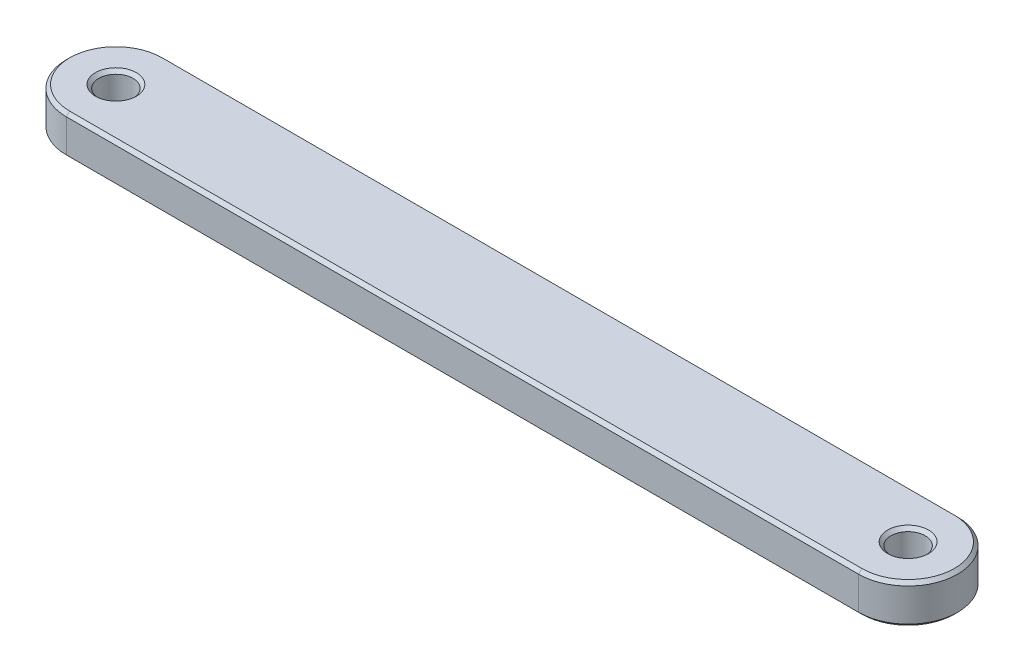
ISO-10303-21;
HEADER;
FILE_DESCRIPTION(('STEP AP214'),'2;1');
FILE_NAME('part.step','',(''),(''),'','','');
FILE_SCHEMA(('AUTOMOTIVE_DESIGN { 1 0 10303 214 1 1 1 1 }'));
ENDSEC;
DATA;
#1=APPLICATION_CONTEXT('core data for automotive mechanical design processes');
#2=APPLICATION_PROTOCOL_DEFINITION('international standard','automotive_design',2000,#1);
#3=PRODUCT_CONTEXT('',#1,'mechanical');
#4=PRODUCT('Part','Part','',(#3));
#5=PRODUCT_RELATED_PRODUCT_CATEGORY('part','',(#4));
#6=PRODUCT_DEFINITION_FORMATION('','',#4);
#7=PRODUCT_DEFINITION_CONTEXT('part definition',#1,'design');
#8=PRODUCT_DEFINITION('design','',#6,#7);
#9=PRODUCT_DEFINITION_SHAPE('','',#8);
#10=(LENGTH_UNIT() NAMED_UNIT(*) SI_UNIT(.MILLI.,.METRE.));
#11=(NAMED_UNIT(*) PLANE_ANGLE_UNIT() SI_UNIT($,.RADIAN.));
#12=(NAMED_UNIT(*) SI_UNIT($,.STERADIAN.) SOLID_ANGLE_UNIT());
#13=UNCERTAINTY_MEASURE_WITH_UNIT(LENGTH_MEASURE(1.E-05),#10,'distance_accuracy_value','');
#14=(GEOMETRIC_REPRESENTATION_CONTEXT(3) GLOBAL_UNCERTAINTY_ASSIGNED_CONTEXT((#13)) GLOBAL_UNIT_ASSIGNED_CONTEXT((#10,
#11,#12)) REPRESENTATION_CONTEXT('',''));
#15=CARTESIAN_POINT('',(0.,0.,0.));
#16=DIRECTION('',(0.,0.,1.));
#17=DIRECTION('',(1.,0.,0.));
#18=AXIS2_PLACEMENT_3D('',#15,#16,#17);
#19=CARTESIAN_POINT('',(0.,3.,7.5));
#20=DIRECTION('',(0.,0.,-1.));
#21=DIRECTION('',(-1.,0.,0.));
#22=AXIS2_PLACEMENT_3D('',#19,#20,#21);
#23=PLANE('',#22);
#24=DIRECTION('',(0.,-1.,0.));
#25=VECTOR('',#24,1.);
#26=CARTESIAN_POINT('',(0.,3.,7.5));
#27=LINE('',#26,#25);
#28=CARTESIAN_POINT('',(0.,2.5,7.5));
#29=VERTEX_POINT('',#28);
#30=CARTESIAN_POINT('',(0.,-2.5,7.5));
#31=VERTEX_POINT('',#30);
#32=EDGE_CURVE('E163',#29,#31,#27,.T.);
#33=ORIENTED_EDGE('',*,*,#32,.T.);
#34=DIRECTION('',(1.,0.,0.));
#35=VECTOR('',#34,1.);
#36=CARTESIAN_POINT('',(0.,-2.5,7.5));
#37=LINE('',#36,#35);
#38=CARTESIAN_POINT('',(120.,-2.5,7.5));
#39=VERTEX_POINT('',#38);
#40=EDGE_CURVE('E201',#31,#39,#37,.T.);
#41=ORIENTED_EDGE('',*,*,#40,.T.);
#42=DIRECTION('',(0.,-1.,0.));
#43=VECTOR('',#42,1.);
#44=CARTESIAN_POINT('',(120.,3.,7.5));
#45=LINE('',#44,#43);
#46=CARTESIAN_POINT('',(120.,2.5,7.5));
#47=VERTEX_POINT('',#46);
#48=EDGE_CURVE('E133',#47,#39,#45,.T.);
#49=ORIENTED_EDGE('',*,*,#48,.F.);
#50=DIRECTION('',(-1.,0.,0.));
#51=VECTOR('',#50,1.);
#52=CARTESIAN_POINT('',(0.,2.5,7.5));
#53=LINE('',#52,#51);
#54=EDGE_CURVE('E204',#47,#29,#53,.T.);
#55=ORIENTED_EDGE('',*,*,#54,.T.);
#56=EDGE_LOOP('',(#33,#41,#49,#55));
#57=FACE_BOUND('',#56,.T.);
#58=ADVANCED_FACE('F42',(#57),#23,.F.);
#59=CARTESIAN_POINT('',(120.,3.,0.));
#60=DIRECTION('',(0.,-1.,0.));
#61=DIRECTION('',(0.,0.,-1.));
#62=AXIS2_PLACEMENT_3D('',#59,#60,#61);
#63=CYLINDRICAL_SURFACE('',#62,7.5);
#64=ORIENTED_EDGE('',*,*,#48,.T.);
#65=CARTESIAN_POINT('',(120.,-2.5,0.));
#66=DIRECTION('',(0.,1.,0.));
#67=DIRECTION('',(0.,0.,1.));
#68=AXIS2_PLACEMENT_3D('',#65,#66,#67);
#69=CIRCLE('',#68,7.5);
#70=CARTESIAN_POINT('',(120.,-2.5,-7.5));
#71=VERTEX_POINT('',#70);
#72=EDGE_CURVE('E131',#39,#71,#69,.T.);
#73=ORIENTED_EDGE('',*,*,#72,.T.);
#74=DIRECTION('',(0.,-1.,0.));
#75=VECTOR('',#74,1.);
#76=CARTESIAN_POINT('',(120.,3.,-7.5));
#77=LINE('',#76,#75);
#78=CARTESIAN_POINT('',(120.,2.5,-7.5));
#79=VERTEX_POINT('',#78);
#80=EDGE_CURVE('E113',#79,#71,#77,.T.);
#81=ORIENTED_EDGE('',*,*,#80,.F.);
#82=CARTESIAN_POINT('',(120.,2.5,0.));
#83=DIRECTION('',(0.,1.,0.));
#84=DIRECTION('',(0.,0.,1.));
#85=AXIS2_PLACEMENT_3D('',#82,#83,#84);
#86=CIRCLE('',#85,7.5);
#87=EDGE_CURVE('E128',#79,#47,#86,.F.);
#88=ORIENTED_EDGE('',*,*,#87,.T.);
#89=EDGE_LOOP('',(#64,#73,#81,#88));
#90=FACE_BOUND('',#89,.T.);
#91=ADVANCED_FACE('F127',(#90),#63,.T.);
#92=CARTESIAN_POINT('',(0.,3.,-7.5));
#93=DIRECTION('',(0.,0.,-1.));
#94=DIRECTION('',(-1.,0.,0.));
#95=AXIS2_PLACEMENT_3D('',#92,#93,#94);
#96=PLANE('',#95);
#97=ORIENTED_EDGE('',*,*,#80,.T.);
#98=DIRECTION('',(-1.,0.,0.));
#99=VECTOR('',#98,1.);
#100=CARTESIAN_POINT('',(0.,-2.5,-7.5));
#101=LINE('',#100,#99);
#102=CARTESIAN_POINT('',(0.,-2.5,-7.5));
#103=VERTEX_POINT('',#102);
#104=EDGE_CURVE('E120',#71,#103,#101,.T.);
#105=ORIENTED_EDGE('',*,*,#104,.T.);
#106=DIRECTION('',(0.,-1.,0.));
#107=VECTOR('',#106,1.);
#108=CARTESIAN_POINT('',(0.,3.,-7.5));
#109=LINE('',#108,#107);
#110=CARTESIAN_POINT('',(0.,2.5,-7.5));
#111=VERTEX_POINT('',#110);
#112=EDGE_CURVE('E115',#111,#103,#109,.T.);
#113=ORIENTED_EDGE('',*,*,#112,.F.);
#114=DIRECTION('',(1.,0.,0.));
#115=VECTOR('',#114,1.);
#116=CARTESIAN_POINT('',(0.,2.5,-7.5));
#117=LINE('',#116,#115);
#118=EDGE_CURVE('E110',#111,#79,#117,.T.);
#119=ORIENTED_EDGE('',*,*,#118,.T.);
#120=EDGE_LOOP('',(#97,#105,#113,#119));
#121=FACE_BOUND('',#120,.T.);
#122=ADVANCED_FACE('F112',(#121),#96,.T.);
#123=CARTESIAN_POINT('',(120.,3.,0.));
#124=DIRECTION('',(0.,-1.,0.));
#125=DIRECTION('',(0.,0.,-1.));
#126=AXIS2_PLACEMENT_3D('',#123,#124,#125);
#127=CYLINDRICAL_SURFACE('',#126,2.59999999999999);
#128=CARTESIAN_POINT('',(120.,-2.49999999999998,0.));
#129=DIRECTION('',(0.,1.,0.));
#130=DIRECTION('',(0.,0.,1.));
#131=AXIS2_PLACEMENT_3D('',#128,#129,#130);
#132=CIRCLE('',#131,2.59999999999999);
#133=CARTESIAN_POINT('',(120.,-2.49999999999998,2.59999999999999));
#134=VERTEX_POINT('',#133);
#135=EDGE_CURVE('E193',#134,#134,#132,.F.);
#136=ORIENTED_EDGE('',*,*,#135,.T.);
#137=EDGE_LOOP('',(#136));
#138=FACE_BOUND('',#137,.T.);
#139=CARTESIAN_POINT('',(120.,2.50000000000002,0.));
#140=DIRECTION('',(0.,1.,0.));
#141=DIRECTION('',(0.,0.,1.));
#142=AXIS2_PLACEMENT_3D('',#139,#140,#141);
#143=CIRCLE('',#142,2.59999999999999);
#144=CARTESIAN_POINT('',(120.,2.50000000000002,2.59999999999999));
#145=VERTEX_POINT('',#144);
#146=EDGE_CURVE('E197',#145,#145,#143,.T.);
#147=ORIENTED_EDGE('',*,*,#146,.T.);
#148=EDGE_LOOP('',(#147));
#149=FACE_BOUND('',#148,.T.);
#150=ADVANCED_FACE('F288',(#138,#149),#127,.F.);
#151=CARTESIAN_POINT('',(0.,3.,0.));
#152=DIRECTION('',(0.,-1.,0.));
#153=DIRECTION('',(0.,0.,-1.));
#154=AXIS2_PLACEMENT_3D('',#151,#152,#153);
#155=CYLINDRICAL_SURFACE('',#154,2.6);
#156=CARTESIAN_POINT('',(0.,-2.49999999999999,0.));
#157=DIRECTION('',(0.,1.,0.));
#158=DIRECTION('',(0.,0.,1.));
#159=AXIS2_PLACEMENT_3D('',#156,#157,#158);
#160=CIRCLE('',#159,2.6);
#161=CARTESIAN_POINT('',(0.,-2.49999999999999,2.6));
#162=VERTEX_POINT('',#161);
#163=EDGE_CURVE('E185',#162,#162,#160,.F.);
#164=ORIENTED_EDGE('',*,*,#163,.T.);
#165=EDGE_LOOP('',(#164));
#166=FACE_BOUND('',#165,.T.);
#167=CARTESIAN_POINT('',(0.,2.5,0.));
#168=DIRECTION('',(0.,1.,0.));
#169=DIRECTION('',(0.,0.,1.));
#170=AXIS2_PLACEMENT_3D('',#167,#168,#169);
#171=CIRCLE('',#170,2.6);
#172=CARTESIAN_POINT('',(0.,2.5,2.6));
#173=VERTEX_POINT('',#172);
#174=EDGE_CURVE('E189',#173,#173,#171,.T.);
#175=ORIENTED_EDGE('',*,*,#174,.T.);
#176=EDGE_LOOP('',(#175));
#177=FACE_BOUND('',#176,.T.);
#178=ADVANCED_FACE('F286',(#166,#177),#155,.F.);
#179=CARTESIAN_POINT('',(0.,3.,0.));
#180=DIRECTION('',(0.,-1.,0.));
#181=DIRECTION('',(0.,0.,-1.));
#182=AXIS2_PLACEMENT_3D('',#179,#180,#181);
#183=CYLINDRICAL_SURFACE('',#182,7.5);
#184=ORIENTED_EDGE('',*,*,#112,.T.);
#185=CARTESIAN_POINT('',(0.,-2.5,0.));
#186=DIRECTION('',(0.,1.,0.));
#187=DIRECTION('',(0.,0.,1.));
#188=AXIS2_PLACEMENT_3D('',#185,#186,#187);
#189=CIRCLE('',#188,7.5);
#190=EDGE_CURVE('E207',#103,#31,#189,.T.);
#191=ORIENTED_EDGE('',*,*,#190,.T.);
#192=ORIENTED_EDGE('',*,*,#32,.F.);
#193=CARTESIAN_POINT('',(0.,2.5,0.));
#194=DIRECTION('',(0.,1.,0.));
#195=DIRECTION('',(0.,0.,1.));
#196=AXIS2_PLACEMENT_3D('',#193,#194,#195);
#197=CIRCLE('',#196,7.5);
#198=EDGE_CURVE('E210',#29,#111,#197,.F.);
#199=ORIENTED_EDGE('',*,*,#198,.T.);
#200=EDGE_LOOP('',(#184,#191,#192,#199));
#201=FACE_BOUND('',#200,.T.);
#202=ADVANCED_FACE('F266',(#201),#183,.T.);
#203=CARTESIAN_POINT('',(0.,3.,0.));
#204=DIRECTION('',(0.,1.,0.));
#205=DIRECTION('',(0.,0.,1.));
#206=AXIS2_PLACEMENT_3D('',#203,#204,#205);
#207=PLANE('',#206);
#208=DIRECTION('',(-1.,0.,0.));
#209=VECTOR('',#208,1.);
#210=CARTESIAN_POINT('',(0.,3.,-7.));
#211=LINE('',#210,#209);
#212=CARTESIAN_POINT('',(120.,3.,-7.));
#213=VERTEX_POINT('',#212);
#214=CARTESIAN_POINT('',(0.,3.,-7.));
#215=VERTEX_POINT('',#214);
#216=EDGE_CURVE('E53',#213,#215,#211,.T.);
#217=ORIENTED_EDGE('',*,*,#216,.T.);
#218=CARTESIAN_POINT('',(0.,3.,0.));
#219=DIRECTION('',(0.,1.,0.));
#220=DIRECTION('',(0.,0.,1.));
#221=AXIS2_PLACEMENT_3D('',#218,#219,#220);
#222=CIRCLE('',#221,7.);
#223=CARTESIAN_POINT('',(0.,3.,7.));
#224=VERTEX_POINT('',#223);
#225=EDGE_CURVE('E11',#215,#224,#222,.T.);
#226=ORIENTED_EDGE('',*,*,#225,.T.);
#227=DIRECTION('',(1.,0.,0.));
#228=VECTOR('',#227,1.);
#229=CARTESIAN_POINT('',(120.,3.,7.));
#230=LINE('',#229,#228);
#231=CARTESIAN_POINT('',(120.,3.,7.));
#232=VERTEX_POINT('',#231);
#233=EDGE_CURVE('E174',#224,#232,#230,.T.);
#234=ORIENTED_EDGE('',*,*,#233,.T.);
#235=CARTESIAN_POINT('',(120.,3.,0.));
#236=DIRECTION('',(0.,1.,0.));
#237=DIRECTION('',(0.,0.,1.));
#238=AXIS2_PLACEMENT_3D('',#235,#236,#237);
#239=CIRCLE('',#238,7.);
#240=EDGE_CURVE('E64',#232,#213,#239,.T.);
#241=ORIENTED_EDGE('',*,*,#240,.T.);
#242=EDGE_LOOP('',(#217,#226,#234,#241));
#243=FACE_BOUND('',#242,.T.);
#244=CARTESIAN_POINT('',(120.,3.,0.));
#245=DIRECTION('',(0.,1.,0.));
#246=DIRECTION('',(0.,0.,1.));
#247=AXIS2_PLACEMENT_3D('',#244,#245,#246);
#248=CIRCLE('',#247,3.09999999999996);
#249=CARTESIAN_POINT('',(120.,3.,3.09999999999996));
#250=VERTEX_POINT('',#249);
#251=EDGE_CURVE('E177',#250,#250,#248,.F.);
#252=ORIENTED_EDGE('',*,*,#251,.T.);
#253=EDGE_LOOP('',(#252));
#254=FACE_BOUND('',#253,.T.);
#255=CARTESIAN_POINT('',(0.,3.,0.));
#256=DIRECTION('',(0.,1.,0.));
#257=DIRECTION('',(0.,0.,1.));
#258=AXIS2_PLACEMENT_3D('',#255,#256,#257);
#259=CIRCLE('',#258,3.10000000000001);
#260=CARTESIAN_POINT('',(0.,3.,3.10000000000001));
#261=VERTEX_POINT('',#260);
#262=EDGE_CURVE('E181',#261,#261,#259,.F.);
#263=ORIENTED_EDGE('',*,*,#262,.T.);
#264=EDGE_LOOP('',(#263));
#265=FACE_BOUND('',#264,.T.);
#266=ADVANCED_FACE('F272',(#243,#254,#265),#207,.T.);
#267=CARTESIAN_POINT('',(0.,-3.,0.));
#268=DIRECTION('',(0.,1.,0.));
#269=DIRECTION('',(0.,0.,1.));
#270=AXIS2_PLACEMENT_3D('',#267,#268,#269);
#271=PLANE('',#270);
#272=DIRECTION('',(1.,0.,0.));
#273=VECTOR('',#272,1.);
#274=CARTESIAN_POINT('',(120.,-3.,-7.));
#275=LINE('',#274,#273);
#276=CARTESIAN_POINT('',(0.,-3.,-7.));
#277=VERTEX_POINT('',#276);
#278=CARTESIAN_POINT('',(120.,-3.,-7.));
#279=VERTEX_POINT('',#278);
#280=EDGE_CURVE('E218',#277,#279,#275,.T.);
#281=ORIENTED_EDGE('',*,*,#280,.T.);
#282=CARTESIAN_POINT('',(120.,-3.,0.));
#283=DIRECTION('',(0.,1.,0.));
#284=DIRECTION('',(0.,0.,1.));
#285=AXIS2_PLACEMENT_3D('',#282,#283,#284);
#286=CIRCLE('',#285,7.);
#287=CARTESIAN_POINT('',(120.,-3.,7.));
#288=VERTEX_POINT('',#287);
#289=EDGE_CURVE('E121',#279,#288,#286,.F.);
#290=ORIENTED_EDGE('',*,*,#289,.T.);
#291=DIRECTION('',(-1.,0.,0.));
#292=VECTOR('',#291,1.);
#293=CARTESIAN_POINT('',(0.,-3.,7.));
#294=LINE('',#293,#292);
#295=CARTESIAN_POINT('',(0.,-3.,7.));
#296=VERTEX_POINT('',#295);
#297=EDGE_CURVE('E224',#288,#296,#294,.T.);
#298=ORIENTED_EDGE('',*,*,#297,.T.);
#299=CARTESIAN_POINT('',(0.,-3.,0.));
#300=DIRECTION('',(0.,1.,0.));
#301=DIRECTION('',(0.,0.,1.));
#302=AXIS2_PLACEMENT_3D('',#299,#300,#301);
#303=CIRCLE('',#302,7.);
#304=EDGE_CURVE('E221',#296,#277,#303,.F.);
#305=ORIENTED_EDGE('',*,*,#304,.T.);
#306=EDGE_LOOP('',(#281,#290,#298,#305));
#307=FACE_BOUND('',#306,.T.);
#308=CARTESIAN_POINT('',(120.,-3.,0.));
#309=DIRECTION('',(0.,1.,0.));
#310=DIRECTION('',(0.,0.,1.));
#311=AXIS2_PLACEMENT_3D('',#308,#309,#310);
#312=CIRCLE('',#311,3.10000000000001);
#313=CARTESIAN_POINT('',(120.,-3.,3.10000000000001));
#314=VERTEX_POINT('',#313);
#315=EDGE_CURVE('E227',#314,#314,#312,.T.);
#316=ORIENTED_EDGE('',*,*,#315,.T.);
#317=EDGE_LOOP('',(#316));
#318=FACE_BOUND('',#317,.T.);
#319=CARTESIAN_POINT('',(0.,-3.,0.));
#320=DIRECTION('',(0.,1.,0.));
#321=DIRECTION('',(0.,0.,1.));
#322=AXIS2_PLACEMENT_3D('',#319,#320,#321);
#323=CIRCLE('',#322,3.10000000000001);
#324=CARTESIAN_POINT('',(0.,-3.,3.10000000000001));
#325=VERTEX_POINT('',#324);
#326=EDGE_CURVE('E231',#325,#325,#323,.T.);
#327=ORIENTED_EDGE('',*,*,#326,.T.);
#328=EDGE_LOOP('',(#327));
#329=FACE_BOUND('',#328,.T.);
#330=ADVANCED_FACE('F275',(#307,#318,#329),#271,.F.);
#331=CARTESIAN_POINT('',(0.,-2.5,0.));
#332=DIRECTION('',(0.,1.,0.));
#333=DIRECTION('',(0.,0.,1.));
#334=AXIS2_PLACEMENT_3D('',#331,#332,#333);
#335=CONICAL_SURFACE('',#334,7.5,0.785398163397448);
#336=DIRECTION('',(0.,0.707106781186547,-0.707106781186547));
#337=VECTOR('',#336,1.);
#338=CARTESIAN_POINT('',(0.,-3.,-7.));
#339=LINE('',#338,#337);
#340=EDGE_CURVE('E164',#277,#103,#339,.T.);
#341=ORIENTED_EDGE('',*,*,#340,.F.);
#342=ORIENTED_EDGE('',*,*,#304,.F.);
#343=DIRECTION('',(0.,-0.707106781186547,-0.707106781186547));
#344=VECTOR('',#343,1.);
#345=CARTESIAN_POINT('',(0.,-2.5,7.5));
#346=LINE('',#345,#344);
#347=EDGE_CURVE('E159',#31,#296,#346,.T.);
#348=ORIENTED_EDGE('',*,*,#347,.F.);
#349=ORIENTED_EDGE('',*,*,#190,.F.);
#350=EDGE_LOOP('',(#341,#342,#348,#349));
#351=FACE_BOUND('',#350,.T.);
#352=ADVANCED_FACE('F253',(#351),#335,.T.);
#353=CARTESIAN_POINT('',(0.,-2.5,7.5));
#354=DIRECTION('',(0.,0.707106781186547,-0.707106781186547));
#355=DIRECTION('',(1.,0.,0.));
#356=AXIS2_PLACEMENT_3D('',#353,#354,#355);
#357=PLANE('',#356);
#358=ORIENTED_EDGE('',*,*,#347,.T.);
#359=ORIENTED_EDGE('',*,*,#297,.F.);
#360=DIRECTION('',(0.,-0.707106781186547,-0.707106781186547));
#361=VECTOR('',#360,1.);
#362=CARTESIAN_POINT('',(120.,-2.5,7.5));
#363=LINE('',#362,#361);
#364=EDGE_CURVE('E148',#39,#288,#363,.T.);
#365=ORIENTED_EDGE('',*,*,#364,.F.);
#366=ORIENTED_EDGE('',*,*,#40,.F.);
#367=EDGE_LOOP('',(#358,#359,#365,#366));
#368=FACE_BOUND('',#367,.T.);
#369=ADVANCED_FACE('F257',(#368),#357,.F.);
#370=CARTESIAN_POINT('',(0.,-3.,-7.));
#371=DIRECTION('',(0.,-0.707106781186547,-0.707106781186547));
#372=DIRECTION('',(-1.,0.,0.));
#373=AXIS2_PLACEMENT_3D('',#370,#371,#372);
#374=PLANE('',#373);
#375=ORIENTED_EDGE('',*,*,#340,.T.);
#376=ORIENTED_EDGE('',*,*,#104,.F.);
#377=DIRECTION('',(0.,0.707106781186547,-0.707106781186547));
#378=VECTOR('',#377,1.);
#379=CARTESIAN_POINT('',(120.,-3.,-7.));
#380=LINE('',#379,#378);
#381=EDGE_CURVE('E145',#279,#71,#380,.T.);
#382=ORIENTED_EDGE('',*,*,#381,.F.);
#383=ORIENTED_EDGE('',*,*,#280,.F.);
#384=EDGE_LOOP('',(#375,#376,#382,#383));
#385=FACE_BOUND('',#384,.T.);
#386=ADVANCED_FACE('F265',(#385),#374,.T.);
#387=CARTESIAN_POINT('',(120.,-2.5,0.));
#388=DIRECTION('',(0.,1.,0.));
#389=DIRECTION('',(0.,0.,1.));
#390=AXIS2_PLACEMENT_3D('',#387,#388,#389);
#391=CONICAL_SURFACE('',#390,7.5,0.785398163397448);
#392=ORIENTED_EDGE('',*,*,#364,.T.);
#393=ORIENTED_EDGE('',*,*,#289,.F.);
#394=ORIENTED_EDGE('',*,*,#381,.T.);
#395=ORIENTED_EDGE('',*,*,#72,.F.);
#396=EDGE_LOOP('',(#392,#393,#394,#395));
#397=FACE_BOUND('',#396,.T.);
#398=ADVANCED_FACE('F260',(#397),#391,.T.);
#399=CARTESIAN_POINT('',(120.,-3.,0.));
#400=DIRECTION('',(0.,-1.,0.));
#401=DIRECTION('',(0.,0.,-1.));
#402=AXIS2_PLACEMENT_3D('',#399,#400,#401);
#403=CONICAL_SURFACE('',#402,3.10000000000001,0.785398163397444);
#404=ORIENTED_EDGE('',*,*,#135,.F.);
#405=EDGE_LOOP('',(#404));
#406=FACE_BOUND('',#405,.T.);
#407=ORIENTED_EDGE('',*,*,#315,.F.);
#408=EDGE_LOOP('',(#407));
#409=FACE_BOUND('',#408,.T.);
#410=ADVANCED_FACE('F322',(#406,#409),#403,.F.);
#411=CARTESIAN_POINT('',(0.,-3.,0.));
#412=DIRECTION('',(0.,-1.,0.));
#413=DIRECTION('',(0.,0.,-1.));
#414=AXIS2_PLACEMENT_3D('',#411,#412,#413);
#415=CONICAL_SURFACE('',#414,3.10000000000001,0.785398163397443);
#416=ORIENTED_EDGE('',*,*,#163,.F.);
#417=EDGE_LOOP('',(#416));
#418=FACE_BOUND('',#417,.T.);
#419=ORIENTED_EDGE('',*,*,#326,.F.);
#420=EDGE_LOOP('',(#419));
#421=FACE_BOUND('',#420,.T.);
#422=ADVANCED_FACE('F320',(#418,#421),#415,.F.);
#423=CARTESIAN_POINT('',(120.,3.,0.));
#424=DIRECTION('',(0.,-1.,0.));
#425=DIRECTION('',(0.,0.,-1.));
#426=AXIS2_PLACEMENT_3D('',#423,#424,#425);
#427=CONICAL_SURFACE('',#426,7.,0.785398163397448);
#428=DIRECTION('',(0.,0.707106781186547,-0.707106781186547));
#429=VECTOR('',#428,1.);
#430=CARTESIAN_POINT('',(120.,2.5,7.5));
#431=LINE('',#430,#429);
#432=EDGE_CURVE('E139',#47,#232,#431,.T.);
#433=ORIENTED_EDGE('',*,*,#432,.F.);
#434=ORIENTED_EDGE('',*,*,#87,.F.);
#435=DIRECTION('',(0.,-0.707106781186547,-0.707106781186547));
#436=VECTOR('',#435,1.);
#437=CARTESIAN_POINT('',(120.,3.,-7.));
#438=LINE('',#437,#436);
#439=EDGE_CURVE('E47',#213,#79,#438,.T.);
#440=ORIENTED_EDGE('',*,*,#439,.F.);
#441=ORIENTED_EDGE('',*,*,#240,.F.);
#442=EDGE_LOOP('',(#433,#434,#440,#441));
#443=FACE_BOUND('',#442,.T.);
#444=ADVANCED_FACE('F137',(#443),#427,.T.);
#445=CARTESIAN_POINT('',(0.,2.5,-7.5));
#446=DIRECTION('',(0.,-0.707106781186547,0.707106781186547));
#447=DIRECTION('',(1.,0.,0.));
#448=AXIS2_PLACEMENT_3D('',#445,#446,#447);
#449=PLANE('',#448);
#450=ORIENTED_EDGE('',*,*,#439,.T.);
#451=ORIENTED_EDGE('',*,*,#118,.F.);
#452=DIRECTION('',(0.,-0.707106781186547,-0.707106781186547));
#453=VECTOR('',#452,1.);
#454=CARTESIAN_POINT('',(0.,3.,-7.));
#455=LINE('',#454,#453);
#456=EDGE_CURVE('E150',#215,#111,#455,.T.);
#457=ORIENTED_EDGE('',*,*,#456,.F.);
#458=ORIENTED_EDGE('',*,*,#216,.F.);
#459=EDGE_LOOP('',(#450,#451,#457,#458));
#460=FACE_BOUND('',#459,.T.);
#461=ADVANCED_FACE('F143',(#460),#449,.F.);
#462=CARTESIAN_POINT('',(0.,3.,7.));
#463=DIRECTION('',(0.,0.707106781186547,0.707106781186547));
#464=DIRECTION('',(-1.,0.,0.));
#465=AXIS2_PLACEMENT_3D('',#462,#463,#464);
#466=PLANE('',#465);
#467=ORIENTED_EDGE('',*,*,#432,.T.);
#468=ORIENTED_EDGE('',*,*,#233,.F.);
#469=DIRECTION('',(0.,0.707106781186547,-0.707106781186547));
#470=VECTOR('',#469,1.);
#471=CARTESIAN_POINT('',(0.,2.5,7.5));
#472=LINE('',#471,#470);
#473=EDGE_CURVE('E154',#29,#224,#472,.T.);
#474=ORIENTED_EDGE('',*,*,#473,.F.);
#475=ORIENTED_EDGE('',*,*,#54,.F.);
#476=EDGE_LOOP('',(#467,#468,#474,#475));
#477=FACE_BOUND('',#476,.T.);
#478=ADVANCED_FACE('F271',(#477),#466,.T.);
#479=CARTESIAN_POINT('',(0.,3.,0.));
#480=DIRECTION('',(0.,-1.,0.));
#481=DIRECTION('',(0.,0.,-1.));
#482=AXIS2_PLACEMENT_3D('',#479,#480,#481);
#483=CONICAL_SURFACE('',#482,7.,0.785398163397448);
#484=ORIENTED_EDGE('',*,*,#456,.T.);
#485=ORIENTED_EDGE('',*,*,#198,.F.);
#486=ORIENTED_EDGE('',*,*,#473,.T.);
#487=ORIENTED_EDGE('',*,*,#225,.F.);
#488=EDGE_LOOP('',(#484,#485,#486,#487));
#489=FACE_BOUND('',#488,.T.);
#490=ADVANCED_FACE('F269',(#489),#483,.T.);
#491=CARTESIAN_POINT('',(120.,2.50000000000002,0.));
#492=DIRECTION('',(0.,1.,0.));
#493=DIRECTION('',(0.,0.,1.));
#494=AXIS2_PLACEMENT_3D('',#491,#492,#493);
#495=CONICAL_SURFACE('',#494,2.59999999999999,0.785398163397439);
#496=ORIENTED_EDGE('',*,*,#251,.F.);
#497=EDGE_LOOP('',(#496));
#498=FACE_BOUND('',#497,.T.);
#499=ORIENTED_EDGE('',*,*,#146,.F.);
#500=EDGE_LOOP('',(#499));
#501=FACE_BOUND('',#500,.T.);
#502=ADVANCED_FACE('F283',(#498,#501),#495,.F.);
#503=CARTESIAN_POINT('',(0.,2.5,0.));
#504=DIRECTION('',(0.,1.,0.));
#505=DIRECTION('',(0.,0.,1.));
#506=AXIS2_PLACEMENT_3D('',#503,#504,#505);
#507=CONICAL_SURFACE('',#506,2.6,0.785398163397453);
#508=ORIENTED_EDGE('',*,*,#262,.F.);
#509=EDGE_LOOP('',(#508));
#510=FACE_BOUND('',#509,.T.);
#511=ORIENTED_EDGE('',*,*,#174,.F.);
#512=EDGE_LOOP('',(#511));
#513=FACE_BOUND('',#512,.T.);
#514=ADVANCED_FACE('F45',(#510,#513),#507,.F.);
#515=CLOSED_SHELL('',(#58,#91,#122,#150,#178,#202,#266,#330,#352,#369,#386,#398,#410,#422,#444,
#461,#478,#490,#502,#514));
#516=MANIFOLD_SOLID_BREP('B2',#515);
#517=ADVANCED_BREP_SHAPE_REPRESENTATION('',(#18,#516),#14);
#518=SHAPE_DEFINITION_REPRESENTATION(#9,#517);
ENDSEC;
END-ISO-10303-21;
